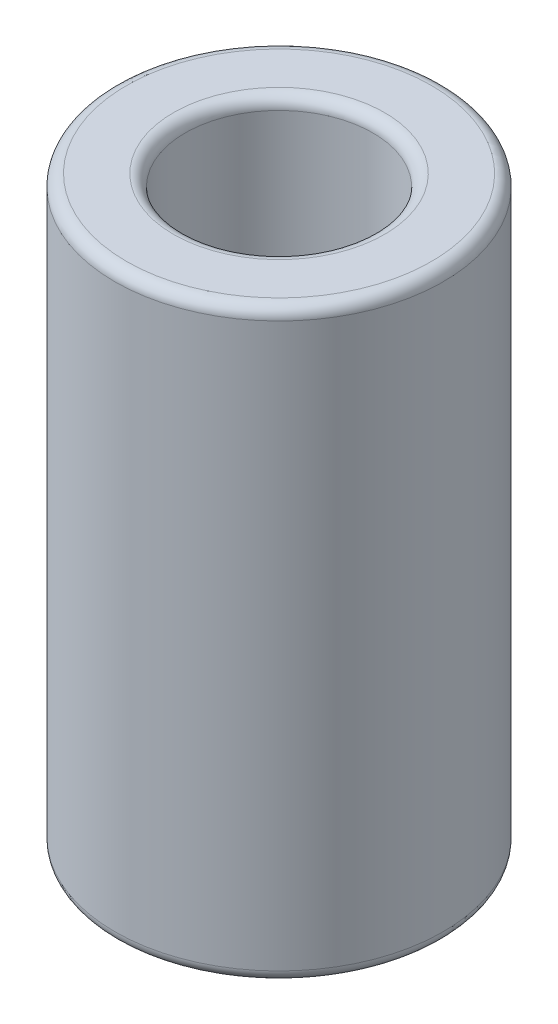
ISO-10303-21;
HEADER;
FILE_DESCRIPTION(('STEP AP214'),'2;1');
FILE_NAME('part.step','',(''),(''),'','','');
FILE_SCHEMA(('AUTOMOTIVE_DESIGN { 1 0 10303 214 1 1 1 1 }'));
ENDSEC;
DATA;
#1=APPLICATION_CONTEXT('core data for automotive mechanical design processes');
#2=APPLICATION_PROTOCOL_DEFINITION('international standard','automotive_design',2000,#1);
#3=PRODUCT_CONTEXT('',#1,'mechanical');
#4=PRODUCT('Part','Part','',(#3));
#5=PRODUCT_RELATED_PRODUCT_CATEGORY('part','',(#4));
#6=PRODUCT_DEFINITION_FORMATION('','',#4);
#7=PRODUCT_DEFINITION_CONTEXT('part definition',#1,'design');
#8=PRODUCT_DEFINITION('design','',#6,#7);
#9=PRODUCT_DEFINITION_SHAPE('','',#8);
#10=(LENGTH_UNIT() NAMED_UNIT(*) SI_UNIT(.MILLI.,.METRE.));
#11=(NAMED_UNIT(*) PLANE_ANGLE_UNIT() SI_UNIT($,.RADIAN.));
#12=(NAMED_UNIT(*) SI_UNIT($,.STERADIAN.) SOLID_ANGLE_UNIT());
#13=UNCERTAINTY_MEASURE_WITH_UNIT(LENGTH_MEASURE(1.E-05),#10,'distance_accuracy_value','');
#14=(GEOMETRIC_REPRESENTATION_CONTEXT(3) GLOBAL_UNCERTAINTY_ASSIGNED_CONTEXT((#13)) GLOBAL_UNIT_ASSIGNED_CONTEXT((#10,
#11,#12)) REPRESENTATION_CONTEXT('',''));
#15=CARTESIAN_POINT('',(0.,0.,0.));
#16=DIRECTION('',(0.,0.,1.));
#17=DIRECTION('',(1.,0.,0.));
#18=AXIS2_PLACEMENT_3D('',#15,#16,#17);
#19=CARTESIAN_POINT('',(0.,12.5,0.));
#20=DIRECTION('',(0.,-1.,0.));
#21=DIRECTION('',(0.,0.,-1.));
#22=AXIS2_PLACEMENT_3D('',#19,#20,#21);
#23=CYLINDRICAL_SURFACE('',#22,2.5);
#24=CARTESIAN_POINT('',(0.,-12.,0.));
#25=DIRECTION('',(0.,1.,0.));
#26=DIRECTION('',(0.,0.,1.));
#27=AXIS2_PLACEMENT_3D('',#24,#25,#26);
#28=CIRCLE('',#27,2.5);
#29=CARTESIAN_POINT('',(0.,-12.,2.5));
#30=VERTEX_POINT('',#29);
#31=EDGE_CURVE('E38',#30,#30,#28,.F.);
#32=ORIENTED_EDGE('',*,*,#31,.T.);
#33=EDGE_LOOP('',(#32));
#34=FACE_BOUND('',#33,.T.);
#35=CARTESIAN_POINT('',(0.,2.5,0.));
#36=DIRECTION('',(0.,1.,0.));
#37=DIRECTION('',(0.,0.,1.));
#38=AXIS2_PLACEMENT_3D('',#35,#36,#37);
#39=CIRCLE('',#38,2.5);
#40=CARTESIAN_POINT('',(0.,2.5,2.5));
#41=VERTEX_POINT('',#40);
#42=EDGE_CURVE('E47',#41,#41,#39,.T.);
#43=ORIENTED_EDGE('',*,*,#42,.T.);
#44=EDGE_LOOP('',(#43));
#45=FACE_BOUND('',#44,.T.);
#46=ADVANCED_FACE('F15',(#34,#45),#23,.F.);
#47=CARTESIAN_POINT('',(0.,12.5,0.));
#48=DIRECTION('',(0.,1.,0.));
#49=DIRECTION('',(0.,0.,1.));
#50=AXIS2_PLACEMENT_3D('',#47,#48,#49);
#51=PLANE('',#50);
#52=CARTESIAN_POINT('',(0.,12.5,0.));
#53=DIRECTION('',(0.,1.,0.));
#54=DIRECTION('',(0.,0.,1.));
#55=AXIS2_PLACEMENT_3D('',#52,#53,#54);
#56=CIRCLE('',#55,6.5);
#57=CARTESIAN_POINT('',(0.,12.5,6.5));
#58=VERTEX_POINT('',#57);
#59=EDGE_CURVE('E22',#58,#58,#56,.T.);
#60=ORIENTED_EDGE('',*,*,#59,.T.);
#61=EDGE_LOOP('',(#60));
#62=FACE_BOUND('',#61,.T.);
#63=CARTESIAN_POINT('',(0.,12.5,0.));
#64=DIRECTION('',(0.,1.,0.));
#65=DIRECTION('',(0.,0.,1.));
#66=AXIS2_PLACEMENT_3D('',#63,#64,#65);
#67=CIRCLE('',#66,4.5);
#68=CARTESIAN_POINT('',(0.,12.5,4.5));
#69=VERTEX_POINT('',#68);
#70=EDGE_CURVE('E26',#69,#69,#67,.F.);
#71=ORIENTED_EDGE('',*,*,#70,.T.);
#72=EDGE_LOOP('',(#71));
#73=FACE_BOUND('',#72,.T.);
#74=ADVANCED_FACE('F74',(#62,#73),#51,.T.);
#75=CARTESIAN_POINT('',(0.,-12.5,0.));
#76=DIRECTION('',(0.,1.,0.));
#77=DIRECTION('',(0.,0.,1.));
#78=AXIS2_PLACEMENT_3D('',#75,#76,#77);
#79=PLANE('',#78);
#80=CARTESIAN_POINT('',(0.,-12.5,0.));
#81=DIRECTION('',(0.,1.,0.));
#82=DIRECTION('',(0.,0.,1.));
#83=AXIS2_PLACEMENT_3D('',#80,#81,#82);
#84=CIRCLE('',#83,3.);
#85=CARTESIAN_POINT('',(0.,-12.5,3.));
#86=VERTEX_POINT('',#85);
#87=EDGE_CURVE('E41',#86,#86,#84,.T.);
#88=ORIENTED_EDGE('',*,*,#87,.T.);
#89=EDGE_LOOP('',(#88));
#90=FACE_BOUND('',#89,.T.);
#91=CARTESIAN_POINT('',(0.,-12.5,0.));
#92=DIRECTION('',(0.,1.,0.));
#93=DIRECTION('',(0.,0.,1.));
#94=AXIS2_PLACEMENT_3D('',#91,#92,#93);
#95=CIRCLE('',#94,6.5);
#96=CARTESIAN_POINT('',(0.,-12.5,6.5));
#97=VERTEX_POINT('',#96);
#98=EDGE_CURVE('E44',#97,#97,#95,.F.);
#99=ORIENTED_EDGE('',*,*,#98,.T.);
#100=EDGE_LOOP('',(#99));
#101=FACE_BOUND('',#100,.T.);
#102=ADVANCED_FACE('F69',(#90,#101),#79,.F.);
#103=CARTESIAN_POINT('',(0.,12.5,0.));
#104=DIRECTION('',(0.,-1.,0.));
#105=DIRECTION('',(0.,0.,-1.));
#106=AXIS2_PLACEMENT_3D('',#103,#104,#105);
#107=CYLINDRICAL_SURFACE('',#106,7.);
#108=CARTESIAN_POINT('',(0.,-12.,0.));
#109=DIRECTION('',(0.,1.,0.));
#110=DIRECTION('',(0.,0.,1.));
#111=AXIS2_PLACEMENT_3D('',#108,#109,#110);
#112=CIRCLE('',#111,7.);
#113=CARTESIAN_POINT('',(0.,-12.,7.));
#114=VERTEX_POINT('',#113);
#115=EDGE_CURVE('E30',#114,#114,#112,.T.);
#116=ORIENTED_EDGE('',*,*,#115,.T.);
#117=EDGE_LOOP('',(#116));
#118=FACE_BOUND('',#117,.T.);
#119=CARTESIAN_POINT('',(0.,12.,0.));
#120=DIRECTION('',(0.,1.,0.));
#121=DIRECTION('',(0.,0.,1.));
#122=AXIS2_PLACEMENT_3D('',#119,#120,#121);
#123=CIRCLE('',#122,7.);
#124=CARTESIAN_POINT('',(0.,12.,7.));
#125=VERTEX_POINT('',#124);
#126=EDGE_CURVE('E35',#125,#125,#123,.F.);
#127=ORIENTED_EDGE('',*,*,#126,.T.);
#128=EDGE_LOOP('',(#127));
#129=FACE_BOUND('',#128,.T.);
#130=ADVANCED_FACE('F58',(#118,#129),#107,.T.);
#131=CARTESIAN_POINT('',(0.,2.5,0.));
#132=DIRECTION('',(0.,1.,0.));
#133=DIRECTION('',(0.,0.,1.));
#134=AXIS2_PLACEMENT_3D('',#131,#132,#133);
#135=CYLINDRICAL_SURFACE('',#134,4.);
#136=CARTESIAN_POINT('',(0.,12.,0.));
#137=DIRECTION('',(0.,1.,0.));
#138=DIRECTION('',(0.,0.,1.));
#139=AXIS2_PLACEMENT_3D('',#136,#137,#138);
#140=CIRCLE('',#139,4.);
#141=CARTESIAN_POINT('',(0.,12.,4.));
#142=VERTEX_POINT('',#141);
#143=EDGE_CURVE('E10',#142,#142,#140,.T.);
#144=ORIENTED_EDGE('',*,*,#143,.T.);
#145=EDGE_LOOP('',(#144));
#146=FACE_BOUND('',#145,.T.);
#147=CARTESIAN_POINT('',(0.,2.5,0.));
#148=DIRECTION('',(0.,1.,0.));
#149=DIRECTION('',(0.,0.,1.));
#150=AXIS2_PLACEMENT_3D('',#147,#148,#149);
#151=CIRCLE('',#150,4.);
#152=CARTESIAN_POINT('',(0.,2.5,4.));
#153=VERTEX_POINT('',#152);
#154=EDGE_CURVE('E50',#153,#153,#151,.T.);
#155=ORIENTED_EDGE('',*,*,#154,.F.);
#156=EDGE_LOOP('',(#155));
#157=FACE_BOUND('',#156,.T.);
#158=ADVANCED_FACE('F56',(#146,#157),#135,.F.);
#159=CARTESIAN_POINT('',(0.,2.5,0.));
#160=DIRECTION('',(0.,1.,0.));
#161=DIRECTION('',(0.,0.,1.));
#162=AXIS2_PLACEMENT_3D('',#159,#160,#161);
#163=PLANE('',#162);
#164=ORIENTED_EDGE('',*,*,#42,.F.);
#165=EDGE_LOOP('',(#164));
#166=FACE_BOUND('',#165,.T.);
#167=ORIENTED_EDGE('',*,*,#154,.T.);
#168=EDGE_LOOP('',(#167));
#169=FACE_BOUND('',#168,.T.);
#170=ADVANCED_FACE('F54',(#166,#169),#163,.T.);
#171=CARTESIAN_POINT('',(0.,-12.,0.));
#172=DIRECTION('',(0.,1.,0.));
#173=DIRECTION('',(0.,0.,1.));
#174=AXIS2_PLACEMENT_3D('',#171,#172,#173);
#175=TOROIDAL_SURFACE('',#174,3.,0.5);
#176=ORIENTED_EDGE('',*,*,#31,.F.);
#177=EDGE_LOOP('',(#176));
#178=FACE_BOUND('',#177,.T.);
#179=ORIENTED_EDGE('',*,*,#87,.F.);
#180=EDGE_LOOP('',(#179));
#181=FACE_BOUND('',#180,.T.);
#182=ADVANCED_FACE('F66',(#178,#181),#175,.T.);
#183=CARTESIAN_POINT('',(0.,-12.,0.));
#184=DIRECTION('',(0.,1.,0.));
#185=DIRECTION('',(0.,0.,1.));
#186=AXIS2_PLACEMENT_3D('',#183,#184,#185);
#187=TOROIDAL_SURFACE('',#186,6.5,0.5);
#188=ORIENTED_EDGE('',*,*,#98,.F.);
#189=EDGE_LOOP('',(#188));
#190=FACE_BOUND('',#189,.T.);
#191=ORIENTED_EDGE('',*,*,#115,.F.);
#192=EDGE_LOOP('',(#191));
#193=FACE_BOUND('',#192,.T.);
#194=ADVANCED_FACE('F88',(#190,#193),#187,.T.);
#195=CARTESIAN_POINT('',(0.,12.,0.));
#196=DIRECTION('',(0.,1.,0.));
#197=DIRECTION('',(0.,0.,1.));
#198=AXIS2_PLACEMENT_3D('',#195,#196,#197);
#199=TOROIDAL_SURFACE('',#198,6.5,0.5);
#200=ORIENTED_EDGE('',*,*,#126,.F.);
#201=EDGE_LOOP('',(#200));
#202=FACE_BOUND('',#201,.T.);
#203=ORIENTED_EDGE('',*,*,#59,.F.);
#204=EDGE_LOOP('',(#203));
#205=FACE_BOUND('',#204,.T.);
#206=ADVANCED_FACE('F91',(#202,#205),#199,.T.);
#207=CARTESIAN_POINT('',(0.,12.,0.));
#208=DIRECTION('',(0.,1.,0.));
#209=DIRECTION('',(0.,0.,1.));
#210=AXIS2_PLACEMENT_3D('',#207,#208,#209);
#211=TOROIDAL_SURFACE('',#210,4.5,0.5);
#212=ORIENTED_EDGE('',*,*,#70,.F.);
#213=EDGE_LOOP('',(#212));
#214=FACE_BOUND('',#213,.T.);
#215=ORIENTED_EDGE('',*,*,#143,.F.);
#216=EDGE_LOOP('',(#215));
#217=FACE_BOUND('',#216,.T.);
#218=ADVANCED_FACE('F17',(#214,#217),#211,.T.);
#219=CLOSED_SHELL('',(#46,#74,#102,#130,#158,#170,#182,#194,#206,#218));
#220=MANIFOLD_SOLID_BREP('B1',#219);
#221=ADVANCED_BREP_SHAPE_REPRESENTATION('',(#18,#220),#14);
#222=SHAPE_DEFINITION_REPRESENTATION(#9,#221);
ENDSEC;
END-ISO-10303-21;
